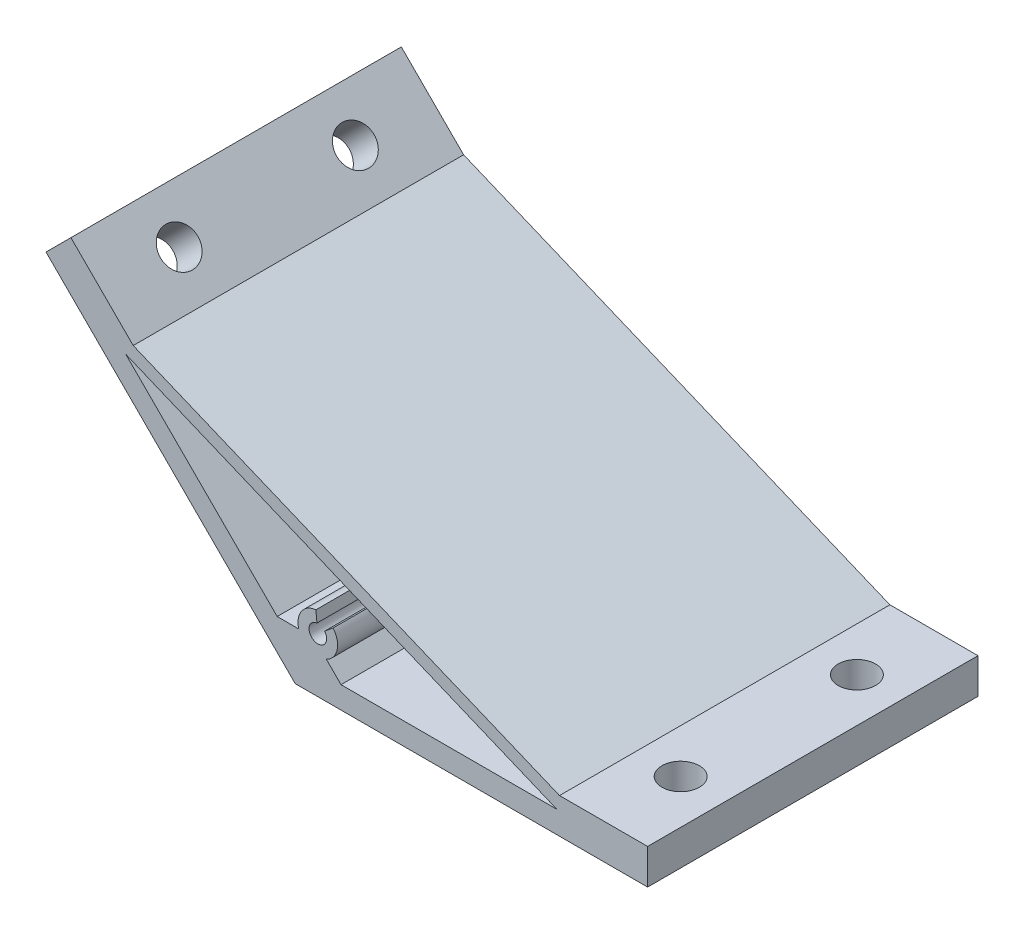
ISO-10303-21;
HEADER;
FILE_DESCRIPTION(('STEP AP214'),'2;1');
FILE_NAME('part.step','',(''),(''),'','','');
FILE_SCHEMA(('AUTOMOTIVE_DESIGN { 1 0 10303 214 1 1 1 1 }'));
ENDSEC;
DATA;
#1=APPLICATION_CONTEXT('core data for automotive mechanical design processes');
#2=APPLICATION_PROTOCOL_DEFINITION('international standard','automotive_design',2000,#1);
#3=PRODUCT_CONTEXT('',#1,'mechanical');
#4=PRODUCT('Part','Part','',(#3));
#5=PRODUCT_RELATED_PRODUCT_CATEGORY('part','',(#4));
#6=PRODUCT_DEFINITION_FORMATION('','',#4);
#7=PRODUCT_DEFINITION_CONTEXT('part definition',#1,'design');
#8=PRODUCT_DEFINITION('design','',#6,#7);
#9=PRODUCT_DEFINITION_SHAPE('','',#8);
#10=(LENGTH_UNIT() NAMED_UNIT(*) SI_UNIT(.MILLI.,.METRE.));
#11=(NAMED_UNIT(*) PLANE_ANGLE_UNIT() SI_UNIT($,.RADIAN.));
#12=(NAMED_UNIT(*) SI_UNIT($,.STERADIAN.) SOLID_ANGLE_UNIT());
#13=UNCERTAINTY_MEASURE_WITH_UNIT(LENGTH_MEASURE(1.E-05),#10,'distance_accuracy_value','');
#14=(GEOMETRIC_REPRESENTATION_CONTEXT(3) GLOBAL_UNCERTAINTY_ASSIGNED_CONTEXT((#13)) GLOBAL_UNIT_ASSIGNED_CONTEXT((#10,
#11,#12)) REPRESENTATION_CONTEXT('',''));
#15=CARTESIAN_POINT('',(0.,0.,0.));
#16=DIRECTION('',(0.,0.,1.));
#17=DIRECTION('',(1.,0.,0.));
#18=AXIS2_PLACEMENT_3D('',#15,#16,#17);
#19=CARTESIAN_POINT('',(580.06230191566,1400.39427630612,37.5));
#20=DIRECTION('',(0.382683432365095,0.923879532511285,0.));
#21=DIRECTION('',(-0.923879532511285,0.382683432365095,0.));
#22=AXIS2_PLACEMENT_3D('',#19,#20,#21);
#23=PLANE('',#22);
#24=DIRECTION('',(0.923879532511285,-0.382683432365095,0.));
#25=VECTOR('',#24,1.);
#26=CARTESIAN_POINT('',(580.06230191566,1400.39427630612,-37.5));
#27=LINE('',#26,#25);
#28=CARTESIAN_POINT('',(6955.91811216156,-1240.57167203307,-37.5));
#29=VERTEX_POINT('',#28);
#30=CARTESIAN_POINT('',(7052.68766478326,-1280.65493315376,-37.5));
#31=VERTEX_POINT('',#30);
#32=EDGE_CURVE('E298',#29,#31,#27,.T.);
#33=ORIENTED_EDGE('',*,*,#32,.F.);
#34=DIRECTION('',(0.,0.,-1.));
#35=VECTOR('',#34,1.);
#36=CARTESIAN_POINT('',(6955.91811216156,-1240.57167203307,37.5));
#37=LINE('',#36,#35);
#38=CARTESIAN_POINT('',(6955.91811216156,-1240.57167203307,37.5));
#39=VERTEX_POINT('',#38);
#40=EDGE_CURVE('E11',#39,#29,#37,.T.);
#41=ORIENTED_EDGE('',*,*,#40,.F.);
#42=DIRECTION('',(0.923879532511285,-0.382683432365095,0.));
#43=VECTOR('',#42,1.);
#44=CARTESIAN_POINT('',(580.06230191566,1400.39427630612,37.5));
#45=LINE('',#44,#43);
#46=CARTESIAN_POINT('',(7052.68766478326,-1280.65493315376,37.5));
#47=VERTEX_POINT('',#46);
#48=EDGE_CURVE('E263',#39,#47,#45,.T.);
#49=ORIENTED_EDGE('',*,*,#48,.T.);
#50=DIRECTION('',(0.,0.,-1.));
#51=VECTOR('',#50,1.);
#52=CARTESIAN_POINT('',(7052.68766478326,-1280.65493315376,37.5));
#53=LINE('',#52,#51);
#54=EDGE_CURVE('E56',#47,#31,#53,.T.);
#55=ORIENTED_EDGE('',*,*,#54,.T.);
#56=EDGE_LOOP('',(#33,#41,#49,#55));
#57=FACE_BOUND('',#56,.T.);
#58=ADVANCED_FACE('F37',(#57),#23,.T.);
#59=CARTESIAN_POINT('',(2857.67322006435,2857.67322006426,37.5));
#60=DIRECTION('',(-0.707106781186559,-0.707106781186536,0.));
#61=DIRECTION('',(0.707106781186536,-0.707106781186559,0.));
#62=AXIS2_PLACEMENT_3D('',#59,#60,#61);
#63=PLANE('',#62);
#64=CARTESIAN_POINT('',(6948.84704434969,-1233.50060422121,-20.));
#65=DIRECTION('',(-0.707106781186559,-0.707106781186536,0.));
#66=DIRECTION('',(0.707106781186536,-0.707106781186559,0.));
#67=AXIS2_PLACEMENT_3D('',#64,#65,#66);
#68=CIRCLE('',#67,4.24999999999998);
#69=CARTESIAN_POINT('',(6951.85224816974,-1236.50580804125,-20.));
#70=VERTEX_POINT('',#69);
#71=EDGE_CURVE('E217',#70,#70,#68,.T.);
#72=ORIENTED_EDGE('',*,*,#71,.T.);
#73=EDGE_LOOP('',(#72));
#74=FACE_BOUND('',#73,.T.);
#75=CARTESIAN_POINT('',(6948.84704434969,-1233.50060422121,20.));
#76=DIRECTION('',(-0.707106781186559,-0.707106781186536,0.));
#77=DIRECTION('',(0.707106781186536,-0.707106781186559,0.));
#78=AXIS2_PLACEMENT_3D('',#75,#76,#77);
#79=CIRCLE('',#78,4.24999999999998);
#80=CARTESIAN_POINT('',(6951.85224816974,-1236.50580804125,20.));
#81=VERTEX_POINT('',#80);
#82=EDGE_CURVE('E224',#81,#81,#79,.T.);
#83=ORIENTED_EDGE('',*,*,#82,.T.);
#84=EDGE_LOOP('',(#83));
#85=FACE_BOUND('',#84,.T.);
#86=DIRECTION('',(-0.707106781186536,0.707106781186559,0.));
#87=VECTOR('',#86,1.);
#88=CARTESIAN_POINT('',(2857.67322006435,2857.67322006426,-37.5));
#89=LINE('',#88,#87);
#90=CARTESIAN_POINT('',(6941.77597653783,-1226.42953640934,-37.5));
#91=VERTEX_POINT('',#90);
#92=EDGE_CURVE('E300',#29,#91,#89,.T.);
#93=ORIENTED_EDGE('',*,*,#92,.T.);
#94=DIRECTION('',(0.,0.,-1.));
#95=VECTOR('',#94,1.);
#96=CARTESIAN_POINT('',(6941.77597653783,-1226.42953640934,37.5));
#97=LINE('',#96,#95);
#98=CARTESIAN_POINT('',(6941.77597653783,-1226.42953640934,37.5));
#99=VERTEX_POINT('',#98);
#100=EDGE_CURVE('E47',#99,#91,#97,.T.);
#101=ORIENTED_EDGE('',*,*,#100,.F.);
#102=DIRECTION('',(-0.707106781186536,0.707106781186559,0.));
#103=VECTOR('',#102,1.);
#104=CARTESIAN_POINT('',(2857.67322006435,2857.67322006426,37.5));
#105=LINE('',#104,#103);
#106=EDGE_CURVE('E265',#39,#99,#105,.T.);
#107=ORIENTED_EDGE('',*,*,#106,.F.);
#108=ORIENTED_EDGE('',*,*,#40,.T.);
#109=EDGE_LOOP('',(#93,#101,#107,#108));
#110=FACE_BOUND('',#109,.T.);
#111=ADVANCED_FACE('F335',(#74,#85,#110),#63,.F.);
#112=CARTESIAN_POINT('',(4084.10275647372,-4084.10275647356,37.5));
#113=DIRECTION('',(-0.707106781186561,0.707106781186534,0.));
#114=DIRECTION('',(-0.707106781186534,-0.707106781186561,0.));
#115=AXIS2_PLACEMENT_3D('',#112,#113,#114);
#116=PLANE('',#115);
#117=DIRECTION('',(0.707106781186534,0.707106781186561,0.));
#118=VECTOR('',#117,1.);
#119=CARTESIAN_POINT('',(4084.10275647372,-4084.10275647356,-37.5));
#120=LINE('',#119,#118);
#121=CARTESIAN_POINT('',(6936.11912228834,-1232.08639065884,-37.5));
#122=VERTEX_POINT('',#121);
#123=EDGE_CURVE('E303',#122,#91,#120,.T.);
#124=ORIENTED_EDGE('',*,*,#123,.F.);
#125=DIRECTION('',(0.,0.,-1.));
#126=VECTOR('',#125,1.);
#127=CARTESIAN_POINT('',(6936.11912228834,-1232.08639065884,37.5));
#128=LINE('',#127,#126);
#129=CARTESIAN_POINT('',(6936.11912228834,-1232.08639065884,37.5));
#130=VERTEX_POINT('',#129);
#131=EDGE_CURVE('E189',#130,#122,#128,.T.);
#132=ORIENTED_EDGE('',*,*,#131,.F.);
#133=DIRECTION('',(0.707106781186534,0.707106781186561,0.));
#134=VECTOR('',#133,1.);
#135=CARTESIAN_POINT('',(4084.10275647372,-4084.10275647356,37.5));
#136=LINE('',#135,#134);
#137=EDGE_CURVE('E267',#130,#99,#136,.T.);
#138=ORIENTED_EDGE('',*,*,#137,.T.);
#139=ORIENTED_EDGE('',*,*,#100,.T.);
#140=EDGE_LOOP('',(#124,#132,#138,#139));
#141=FACE_BOUND('',#140,.T.);
#142=ADVANCED_FACE('F340',(#141),#116,.T.);
#143=CARTESIAN_POINT('',(2852.0163658146,2852.01636581472,37.5));
#144=DIRECTION('',(-0.707106781186532,-0.707106781186563,0.));
#145=DIRECTION('',(0.707106781186563,-0.707106781186532,0.));
#146=AXIS2_PLACEMENT_3D('',#143,#144,#145);
#147=PLANE('',#146);
#148=CARTESIAN_POINT('',(6943.1901901002,-1239.1574584707,-20.));
#149=DIRECTION('',(-0.707106781186532,-0.707106781186563,0.));
#150=DIRECTION('',(0.707106781186563,-0.707106781186532,0.));
#151=AXIS2_PLACEMENT_3D('',#148,#149,#150);
#152=CIRCLE('',#151,4.24999999999999);
#153=CARTESIAN_POINT('',(6946.19539392024,-1242.16266229074,-20.));
#154=VERTEX_POINT('',#153);
#155=EDGE_CURVE('E220',#154,#154,#152,.T.);
#156=ORIENTED_EDGE('',*,*,#155,.F.);
#157=EDGE_LOOP('',(#156));
#158=FACE_BOUND('',#157,.T.);
#159=CARTESIAN_POINT('',(6943.1901901002,-1239.1574584707,20.));
#160=DIRECTION('',(-0.707106781186532,-0.707106781186563,0.));
#161=DIRECTION('',(0.707106781186563,-0.707106781186532,0.));
#162=AXIS2_PLACEMENT_3D('',#159,#160,#161);
#163=CIRCLE('',#162,4.24999999999999);
#164=CARTESIAN_POINT('',(6946.19539392024,-1242.16266229074,20.));
#165=VERTEX_POINT('',#164);
#166=EDGE_CURVE('E219',#165,#165,#163,.T.);
#167=ORIENTED_EDGE('',*,*,#166,.F.);
#168=EDGE_LOOP('',(#167));
#169=FACE_BOUND('',#168,.T.);
#170=DIRECTION('',(-0.707106781186563,0.707106781186532,0.));
#171=VECTOR('',#170,1.);
#172=CARTESIAN_POINT('',(2852.0163658146,2852.01636581472,-37.5));
#173=LINE('',#172,#171);
#174=CARTESIAN_POINT('',(6992.68766478326,-1288.65493315376,-37.5));
#175=VERTEX_POINT('',#174);
#176=EDGE_CURVE('E306',#175,#122,#173,.T.);
#177=ORIENTED_EDGE('',*,*,#176,.F.);
#178=DIRECTION('',(0.,0.,-1.));
#179=VECTOR('',#178,1.);
#180=CARTESIAN_POINT('',(6992.68766478326,-1288.65493315376,37.5));
#181=LINE('',#180,#179);
#182=CARTESIAN_POINT('',(6992.68766478326,-1288.65493315376,37.5));
#183=VERTEX_POINT('',#182);
#184=EDGE_CURVE('E187',#183,#175,#181,.T.);
#185=ORIENTED_EDGE('',*,*,#184,.F.);
#186=DIRECTION('',(-0.707106781186563,0.707106781186532,0.));
#187=VECTOR('',#186,1.);
#188=CARTESIAN_POINT('',(2852.0163658146,2852.01636581472,37.5));
#189=LINE('',#188,#187);
#190=EDGE_CURVE('E181',#183,#130,#189,.T.);
#191=ORIENTED_EDGE('',*,*,#190,.T.);
#192=ORIENTED_EDGE('',*,*,#131,.T.);
#193=EDGE_LOOP('',(#177,#185,#191,#192));
#194=FACE_BOUND('',#193,.T.);
#195=ADVANCED_FACE('F433',(#158,#169,#194),#147,.T.);
#196=CARTESIAN_POINT('',(0.,-1288.65493315376,37.5));
#197=DIRECTION('',(0.,1.,0.));
#198=DIRECTION('',(0.,0.,1.));
#199=AXIS2_PLACEMENT_3D('',#196,#197,#198);
#200=PLANE('',#199);
#201=CARTESIAN_POINT('',(7062.68766478326,-1288.65493315376,-20.));
#202=DIRECTION('',(0.,-1.,0.));
#203=DIRECTION('',(0.,0.,-1.));
#204=AXIS2_PLACEMENT_3D('',#201,#202,#203);
#205=CIRCLE('',#204,4.24999999999986);
#206=CARTESIAN_POINT('',(7062.68766478326,-1288.65493315376,-24.2499999999999));
#207=VERTEX_POINT('',#206);
#208=EDGE_CURVE('E425',#207,#207,#205,.T.);
#209=ORIENTED_EDGE('',*,*,#208,.F.);
#210=EDGE_LOOP('',(#209));
#211=FACE_BOUND('',#210,.T.);
#212=CARTESIAN_POINT('',(7062.68766478326,-1288.65493315376,20.));
#213=DIRECTION('',(0.,-1.,0.));
#214=DIRECTION('',(0.,0.,-1.));
#215=AXIS2_PLACEMENT_3D('',#212,#213,#214);
#216=CIRCLE('',#215,4.24999999999986);
#217=CARTESIAN_POINT('',(7062.68766478326,-1288.65493315376,15.7500000000001));
#218=VERTEX_POINT('',#217);
#219=EDGE_CURVE('E232',#218,#218,#216,.T.);
#220=ORIENTED_EDGE('',*,*,#219,.F.);
#221=EDGE_LOOP('',(#220));
#222=FACE_BOUND('',#221,.T.);
#223=DIRECTION('',(1.,0.,0.));
#224=VECTOR('',#223,1.);
#225=CARTESIAN_POINT('',(0.,-1288.65493315376,-37.5));
#226=LINE('',#225,#224);
#227=CARTESIAN_POINT('',(7072.68766478326,-1288.65493315376,-37.5));
#228=VERTEX_POINT('',#227);
#229=EDGE_CURVE('E186',#175,#228,#226,.T.);
#230=ORIENTED_EDGE('',*,*,#229,.T.);
#231=DIRECTION('',(0.,0.,-1.));
#232=VECTOR('',#231,1.);
#233=CARTESIAN_POINT('',(7072.68766478326,-1288.65493315376,37.5));
#234=LINE('',#233,#232);
#235=CARTESIAN_POINT('',(7072.68766478326,-1288.65493315376,37.5));
#236=VERTEX_POINT('',#235);
#237=EDGE_CURVE('E168',#236,#228,#234,.T.);
#238=ORIENTED_EDGE('',*,*,#237,.F.);
#239=DIRECTION('',(1.,0.,0.));
#240=VECTOR('',#239,1.);
#241=CARTESIAN_POINT('',(0.,-1288.65493315376,37.5));
#242=LINE('',#241,#240);
#243=EDGE_CURVE('E173',#183,#236,#242,.T.);
#244=ORIENTED_EDGE('',*,*,#243,.F.);
#245=ORIENTED_EDGE('',*,*,#184,.T.);
#246=EDGE_LOOP('',(#230,#238,#244,#245));
#247=FACE_BOUND('',#246,.T.);
#248=ADVANCED_FACE('F184',(#211,#222,#247),#200,.F.);
#249=CARTESIAN_POINT('',(7072.68766478326,0.,37.5));
#250=DIRECTION('',(-1.,0.,0.));
#251=DIRECTION('',(0.,0.,1.));
#252=AXIS2_PLACEMENT_3D('',#249,#250,#251);
#253=PLANE('',#252);
#254=DIRECTION('',(0.,1.,0.));
#255=VECTOR('',#254,1.);
#256=CARTESIAN_POINT('',(7072.68766478326,0.,-37.5));
#257=LINE('',#256,#255);
#258=CARTESIAN_POINT('',(7072.68766478326,-1280.65493315376,-37.5));
#259=VERTEX_POINT('',#258);
#260=EDGE_CURVE('E310',#228,#259,#257,.T.);
#261=ORIENTED_EDGE('',*,*,#260,.T.);
#262=DIRECTION('',(0.,0.,-1.));
#263=VECTOR('',#262,1.);
#264=CARTESIAN_POINT('',(7072.68766478326,-1280.65493315376,37.5));
#265=LINE('',#264,#263);
#266=CARTESIAN_POINT('',(7072.68766478326,-1280.65493315376,37.5));
#267=VERTEX_POINT('',#266);
#268=EDGE_CURVE('E109',#267,#259,#265,.T.);
#269=ORIENTED_EDGE('',*,*,#268,.F.);
#270=DIRECTION('',(0.,1.,0.));
#271=VECTOR('',#270,1.);
#272=CARTESIAN_POINT('',(7072.68766478326,0.,37.5));
#273=LINE('',#272,#271);
#274=EDGE_CURVE('E164',#236,#267,#273,.T.);
#275=ORIENTED_EDGE('',*,*,#274,.F.);
#276=ORIENTED_EDGE('',*,*,#237,.T.);
#277=EDGE_LOOP('',(#261,#269,#275,#276));
#278=FACE_BOUND('',#277,.T.);
#279=ADVANCED_FACE('F166',(#278),#253,.F.);
#280=CARTESIAN_POINT('',(6997.82073881189,-1276.26412007604,37.5));
#281=DIRECTION('',(0.,0.,-1.));
#282=DIRECTION('',(-1.,0.,0.));
#283=AXIS2_PLACEMENT_3D('',#280,#281,#282);
#284=CYLINDRICAL_SURFACE('',#283,1.99999999999993);
#285=CARTESIAN_POINT('',(6997.82073881189,-1276.26412007604,-37.5));
#286=DIRECTION('',(0.,0.,1.));
#287=DIRECTION('',(1.,0.,0.));
#288=AXIS2_PLACEMENT_3D('',#285,#286,#287);
#289=CIRCLE('',#288,1.99999999999993);
#290=CARTESIAN_POINT('',(6997.62653003943,-1274.27357167103,-37.5));
#291=VERTEX_POINT('',#290);
#292=CARTESIAN_POINT('',(6999.36559542733,-1274.99391614055,-37.5));
#293=VERTEX_POINT('',#292);
#294=EDGE_CURVE('E238',#291,#293,#289,.T.);
#295=ORIENTED_EDGE('',*,*,#294,.F.);
#296=DIRECTION('',(0.,0.,-1.));
#297=VECTOR('',#296,1.);
#298=CARTESIAN_POINT('',(6997.62653003943,-1274.27357167103,37.5));
#299=LINE('',#298,#297);
#300=CARTESIAN_POINT('',(6997.62653003943,-1274.27357167103,37.5));
#301=VERTEX_POINT('',#300);
#302=EDGE_CURVE('E121',#301,#291,#299,.T.);
#303=ORIENTED_EDGE('',*,*,#302,.F.);
#304=CARTESIAN_POINT('',(6997.82073881189,-1276.26412007604,37.5));
#305=DIRECTION('',(0.,0.,1.));
#306=DIRECTION('',(1.,0.,0.));
#307=AXIS2_PLACEMENT_3D('',#304,#305,#306);
#308=CIRCLE('',#307,1.99999999999993);
#309=CARTESIAN_POINT('',(6999.36559542733,-1274.99391614055,37.5));
#310=VERTEX_POINT('',#309);
#311=EDGE_CURVE('E239',#301,#310,#308,.T.);
#312=ORIENTED_EDGE('',*,*,#311,.T.);
#313=DIRECTION('',(0.,0.,-1.));
#314=VECTOR('',#313,1.);
#315=CARTESIAN_POINT('',(6999.36559542733,-1274.99391614055,37.5));
#316=LINE('',#315,#314);
#317=EDGE_CURVE('E196',#310,#293,#316,.T.);
#318=ORIENTED_EDGE('',*,*,#317,.T.);
#319=EDGE_LOOP('',(#295,#303,#312,#318));
#320=FACE_BOUND('',#319,.T.);
#321=ADVANCED_FACE('F39',(#320),#284,.F.);
#322=CARTESIAN_POINT('',(6808.49128288336,664.273589646761,37.5));
#323=DIRECTION('',(-0.9952742025064,-0.0971043862307417,0.));
#324=DIRECTION('',(0.0971043862307417,-0.9952742025064,0.));
#325=AXIS2_PLACEMENT_3D('',#322,#323,#324);
#326=PLANE('',#325);
#327=DIRECTION('',(-0.0971043862307417,0.9952742025064,0.));
#328=VECTOR('',#327,1.);
#329=CARTESIAN_POINT('',(6808.49128288336,664.273589646761,-37.5));
#330=LINE('',#329,#328);
#331=CARTESIAN_POINT('',(6997.38376907385,-1271.78538616476,-37.5));
#332=VERTEX_POINT('',#331);
#333=EDGE_CURVE('E274',#291,#332,#330,.T.);
#334=ORIENTED_EDGE('',*,*,#333,.T.);
#335=DIRECTION('',(0.,0.,-1.));
#336=VECTOR('',#335,1.);
#337=CARTESIAN_POINT('',(6997.38376907385,-1271.78538616476,37.5));
#338=LINE('',#337,#336);
#339=CARTESIAN_POINT('',(6997.38376907385,-1271.78538616476,37.5));
#340=VERTEX_POINT('',#339);
#341=EDGE_CURVE('E214',#340,#332,#338,.T.);
#342=ORIENTED_EDGE('',*,*,#341,.F.);
#343=DIRECTION('',(-0.0971043862307417,0.9952742025064,0.));
#344=VECTOR('',#343,1.);
#345=CARTESIAN_POINT('',(6808.49128288336,664.273589646761,37.5));
#346=LINE('',#345,#344);
#347=EDGE_CURVE('E241',#301,#340,#346,.T.);
#348=ORIENTED_EDGE('',*,*,#347,.F.);
#349=ORIENTED_EDGE('',*,*,#302,.T.);
#350=EDGE_LOOP('',(#334,#342,#348,#349));
#351=FACE_BOUND('',#350,.T.);
#352=ADVANCED_FACE('F369',(#351),#326,.F.);
#353=CARTESIAN_POINT('',(6997.82073881189,-1276.26412007604,37.5));
#354=DIRECTION('',(0.,0.,-1.));
#355=DIRECTION('',(-1.,0.,0.));
#356=AXIS2_PLACEMENT_3D('',#353,#354,#355);
#357=CYLINDRICAL_SURFACE('',#356,4.49999999999951);
#358=CARTESIAN_POINT('',(6997.82073881189,-1276.26412007604,-37.5));
#359=DIRECTION('',(0.,0.,1.));
#360=DIRECTION('',(1.,0.,0.));
#361=AXIS2_PLACEMENT_3D('',#358,#359,#360);
#362=CIRCLE('',#361,4.49999999999951);
#363=CARTESIAN_POINT('',(6993.49338103034,-1277.49861374974,-37.5));
#364=VERTEX_POINT('',#363);
#365=EDGE_CURVE('E276',#332,#364,#362,.T.);
#366=ORIENTED_EDGE('',*,*,#365,.T.);
#367=DIRECTION('',(0.,0.,-1.));
#368=VECTOR('',#367,1.);
#369=CARTESIAN_POINT('',(6993.49338103034,-1277.49861374974,37.5));
#370=LINE('',#369,#368);
#371=CARTESIAN_POINT('',(6993.49338103034,-1277.49861374974,37.5));
#372=VERTEX_POINT('',#371);
#373=EDGE_CURVE('E212',#372,#364,#370,.T.);
#374=ORIENTED_EDGE('',*,*,#373,.F.);
#375=CARTESIAN_POINT('',(6997.82073881189,-1276.26412007604,37.5));
#376=DIRECTION('',(0.,0.,1.));
#377=DIRECTION('',(1.,0.,0.));
#378=AXIS2_PLACEMENT_3D('',#375,#376,#377);
#379=CIRCLE('',#378,4.49999999999951);
#380=EDGE_CURVE('E244',#340,#372,#379,.T.);
#381=ORIENTED_EDGE('',*,*,#380,.F.);
#382=ORIENTED_EDGE('',*,*,#341,.T.);
#383=EDGE_LOOP('',(#366,#374,#381,#382));
#384=FACE_BOUND('',#383,.T.);
#385=ADVANCED_FACE('F366',(#384),#357,.T.);
#386=CARTESIAN_POINT('',(1.15994087185971E-09,-1277.49861375609,37.5));
#387=DIRECTION('',(-9.079781843749E-13,1.,0.));
#388=DIRECTION('',(-1.,-9.079781843749E-13,0.));
#389=AXIS2_PLACEMENT_3D('',#386,#387,#388);
#390=PLANE('',#389);
#391=DIRECTION('',(1.,9.079781843749E-13,0.));
#392=VECTOR('',#391,1.);
#393=CARTESIAN_POINT('',(1.15994087185971E-09,-1277.49861375609,-37.5));
#394=LINE('',#393,#392);
#395=CARTESIAN_POINT('',(6988.60241319111,-1277.49861374974,-37.5));
#396=VERTEX_POINT('',#395);
#397=EDGE_CURVE('E279',#396,#364,#394,.T.);
#398=ORIENTED_EDGE('',*,*,#397,.F.);
#399=DIRECTION('',(0.,0.,-1.));
#400=VECTOR('',#399,1.);
#401=CARTESIAN_POINT('',(6988.60241319111,-1277.49861374974,37.5));
#402=LINE('',#401,#400);
#403=CARTESIAN_POINT('',(6988.60241319111,-1277.49861374974,37.5));
#404=VERTEX_POINT('',#403);
#405=EDGE_CURVE('E210',#404,#396,#402,.T.);
#406=ORIENTED_EDGE('',*,*,#405,.F.);
#407=DIRECTION('',(1.,9.079781843749E-13,0.));
#408=VECTOR('',#407,1.);
#409=CARTESIAN_POINT('',(1.15994087185971E-09,-1277.49861375609,37.5));
#410=LINE('',#409,#408);
#411=EDGE_CURVE('E246',#404,#372,#410,.T.);
#412=ORIENTED_EDGE('',*,*,#411,.T.);
#413=ORIENTED_EDGE('',*,*,#373,.T.);
#414=EDGE_LOOP('',(#398,#406,#412,#413));
#415=FACE_BOUND('',#414,.T.);
#416=ADVANCED_FACE('F362',(#415),#390,.T.);
#417=CARTESIAN_POINT('',(2855.55189972073,2855.55189972069,37.5));
#418=DIRECTION('',(-0.707106781186552,-0.707106781186543,0.));
#419=DIRECTION('',(0.707106781186543,-0.707106781186552,0.));
#420=AXIS2_PLACEMENT_3D('',#417,#418,#419);
#421=PLANE('',#420);
#422=DIRECTION('',(-0.707106781186543,0.707106781186552,0.));
#423=VECTOR('',#422,1.);
#424=CARTESIAN_POINT('',(2855.55189972073,2855.55189972069,-37.5));
#425=LINE('',#424,#423);
#426=CARTESIAN_POINT('',(6954.21874866951,-1243.11494922814,-37.5));
#427=VERTEX_POINT('',#426);
#428=EDGE_CURVE('E282',#396,#427,#425,.T.);
#429=ORIENTED_EDGE('',*,*,#428,.T.);
#430=DIRECTION('',(0.,0.,-1.));
#431=VECTOR('',#430,1.);
#432=CARTESIAN_POINT('',(6954.21874866951,-1243.11494922814,37.5));
#433=LINE('',#432,#431);
#434=CARTESIAN_POINT('',(6954.21874866951,-1243.11494922814,37.5));
#435=VERTEX_POINT('',#434);
#436=EDGE_CURVE('E207',#435,#427,#433,.T.);
#437=ORIENTED_EDGE('',*,*,#436,.F.);
#438=DIRECTION('',(-0.707106781186543,0.707106781186552,0.));
#439=VECTOR('',#438,1.);
#440=CARTESIAN_POINT('',(2855.55189972073,2855.55189972069,37.5));
#441=LINE('',#440,#439);
#442=EDGE_CURVE('E249',#404,#435,#441,.T.);
#443=ORIENTED_EDGE('',*,*,#442,.F.);
#444=ORIENTED_EDGE('',*,*,#405,.T.);
#445=EDGE_LOOP('',(#429,#437,#443,#444));
#446=FACE_BOUND('',#445,.T.);
#447=ADVANCED_FACE('F358',(#446),#421,.F.);
#448=CARTESIAN_POINT('',(578.914251618586,1397.62263770862,37.5));
#449=DIRECTION('',(0.3826834323651,0.923879532511283,0.));
#450=DIRECTION('',(-0.923879532511283,0.3826834323651,0.));
#451=AXIS2_PLACEMENT_3D('',#448,#449,#450);
#452=PLANE('',#451);
#453=DIRECTION('',(0.923879532511283,-0.3826834323651,0.));
#454=VECTOR('',#453,1.);
#455=CARTESIAN_POINT('',(578.914251618586,1397.62263770862,-37.5));
#456=LINE('',#455,#454);
#457=CARTESIAN_POINT('',(7052.09092768112,-1283.65493315376,-37.5));
#458=VERTEX_POINT('',#457);
#459=EDGE_CURVE('E284',#427,#458,#456,.T.);
#460=ORIENTED_EDGE('',*,*,#459,.T.);
#461=DIRECTION('',(0.,0.,-1.));
#462=VECTOR('',#461,1.);
#463=CARTESIAN_POINT('',(7052.09092768112,-1283.65493315376,37.5));
#464=LINE('',#463,#462);
#465=CARTESIAN_POINT('',(7052.09092768112,-1283.65493315376,37.5));
#466=VERTEX_POINT('',#465);
#467=EDGE_CURVE('E205',#466,#458,#464,.T.);
#468=ORIENTED_EDGE('',*,*,#467,.F.);
#469=DIRECTION('',(0.923879532511283,-0.3826834323651,0.));
#470=VECTOR('',#469,1.);
#471=CARTESIAN_POINT('',(578.914251618586,1397.62263770862,37.5));
#472=LINE('',#471,#470);
#473=EDGE_CURVE('E251',#435,#466,#472,.T.);
#474=ORIENTED_EDGE('',*,*,#473,.F.);
#475=ORIENTED_EDGE('',*,*,#436,.T.);
#476=EDGE_LOOP('',(#460,#468,#474,#475));
#477=FACE_BOUND('',#476,.T.);
#478=ADVANCED_FACE('F354',(#477),#452,.F.);
#479=CARTESIAN_POINT('',(-5.8169112753506E-12,-1283.65493315373,37.5));
#480=DIRECTION('',(0.,1.,0.));
#481=DIRECTION('',(-1.,0.,0.));
#482=AXIS2_PLACEMENT_3D('',#479,#480,#481);
#483=PLANE('',#482);
#484=DIRECTION('',(1.,0.,0.));
#485=VECTOR('',#484,1.);
#486=CARTESIAN_POINT('',(-5.8169112753506E-12,-1283.65493315373,-37.5));
#487=LINE('',#486,#485);
#488=CARTESIAN_POINT('',(7003.09092768112,-1283.65493315376,-37.5));
#489=VERTEX_POINT('',#488);
#490=EDGE_CURVE('E287',#489,#458,#487,.T.);
#491=ORIENTED_EDGE('',*,*,#490,.F.);
#492=DIRECTION('',(0.,0.,-1.));
#493=VECTOR('',#492,1.);
#494=CARTESIAN_POINT('',(7003.09092768112,-1283.65493315376,37.5));
#495=LINE('',#494,#493);
#496=CARTESIAN_POINT('',(7003.09092768112,-1283.65493315376,37.5));
#497=VERTEX_POINT('',#496);
#498=EDGE_CURVE('E203',#497,#489,#495,.T.);
#499=ORIENTED_EDGE('',*,*,#498,.F.);
#500=DIRECTION('',(1.,0.,0.));
#501=VECTOR('',#500,1.);
#502=CARTESIAN_POINT('',(-5.8169112753506E-12,-1283.65493315373,37.5));
#503=LINE('',#502,#501);
#504=EDGE_CURVE('E253',#497,#466,#503,.T.);
#505=ORIENTED_EDGE('',*,*,#504,.T.);
#506=ORIENTED_EDGE('',*,*,#467,.T.);
#507=EDGE_LOOP('',(#491,#499,#505,#506));
#508=FACE_BOUND('',#507,.T.);
#509=ADVANCED_FACE('F350',(#508),#483,.T.);
#510=CARTESIAN_POINT('',(2859.71799726508,2859.71799726394,37.5));
#511=DIRECTION('',(-0.707106781186689,-0.707106781186406,0.));
#512=DIRECTION('',(0.707106781186406,-0.707106781186689,0.));
#513=AXIS2_PLACEMENT_3D('',#510,#511,#512);
#514=PLANE('',#513);
#515=DIRECTION('',(-0.707106781186406,0.707106781186689,0.));
#516=VECTOR('',#515,1.);
#517=CARTESIAN_POINT('',(2859.71799726508,2859.71799726394,-37.5));
#518=LINE('',#517,#516);
#519=CARTESIAN_POINT('',(6999.76054974539,-1280.32455521803,-37.5));
#520=VERTEX_POINT('',#519);
#521=EDGE_CURVE('E290',#489,#520,#518,.T.);
#522=ORIENTED_EDGE('',*,*,#521,.T.);
#523=DIRECTION('',(0.,0.,-1.));
#524=VECTOR('',#523,1.);
#525=CARTESIAN_POINT('',(6999.76054974539,-1280.32455521803,37.5));
#526=LINE('',#525,#524);
#527=CARTESIAN_POINT('',(6999.76054974539,-1280.32455521803,37.5));
#528=VERTEX_POINT('',#527);
#529=EDGE_CURVE('E200',#528,#520,#526,.T.);
#530=ORIENTED_EDGE('',*,*,#529,.F.);
#531=DIRECTION('',(-0.707106781186406,0.707106781186689,0.));
#532=VECTOR('',#531,1.);
#533=CARTESIAN_POINT('',(2859.71799726508,2859.71799726394,37.5));
#534=LINE('',#533,#532);
#535=EDGE_CURVE('E256',#497,#528,#534,.T.);
#536=ORIENTED_EDGE('',*,*,#535,.F.);
#537=ORIENTED_EDGE('',*,*,#498,.T.);
#538=EDGE_LOOP('',(#522,#530,#536,#537));
#539=FACE_BOUND('',#538,.T.);
#540=ADVANCED_FACE('F346',(#539),#514,.F.);
#541=CARTESIAN_POINT('',(6997.82073881189,-1276.26412007604,37.5));
#542=DIRECTION('',(0.,0.,-1.));
#543=DIRECTION('',(-1.,0.,0.));
#544=AXIS2_PLACEMENT_3D('',#541,#542,#543);
#545=CYLINDRICAL_SURFACE('',#544,4.50000000000019);
#546=CARTESIAN_POINT('',(6997.82073881189,-1276.26412007604,-37.5));
#547=DIRECTION('',(0.,0.,1.));
#548=DIRECTION('',(1.,0.,0.));
#549=AXIS2_PLACEMENT_3D('',#546,#547,#548);
#550=CIRCLE('',#549,4.50000000000019);
#551=CARTESIAN_POINT('',(7001.29666619663,-1273.40616122119,-37.5));
#552=VERTEX_POINT('',#551);
#553=EDGE_CURVE('E292',#520,#552,#550,.T.);
#554=ORIENTED_EDGE('',*,*,#553,.T.);
#555=DIRECTION('',(0.,0.,-1.));
#556=VECTOR('',#555,1.);
#557=CARTESIAN_POINT('',(7001.29666619663,-1273.40616122119,37.5));
#558=LINE('',#557,#556);
#559=CARTESIAN_POINT('',(7001.29666619663,-1273.40616122119,37.5));
#560=VERTEX_POINT('',#559);
#561=EDGE_CURVE('E198',#560,#552,#558,.T.);
#562=ORIENTED_EDGE('',*,*,#561,.F.);
#563=CARTESIAN_POINT('',(6997.82073881189,-1276.26412007604,37.5));
#564=DIRECTION('',(0.,0.,1.));
#565=DIRECTION('',(1.,0.,0.));
#566=AXIS2_PLACEMENT_3D('',#563,#564,#565);
#567=CIRCLE('',#566,4.50000000000019);
#568=EDGE_CURVE('E258',#528,#560,#567,.T.);
#569=ORIENTED_EDGE('',*,*,#568,.F.);
#570=ORIENTED_EDGE('',*,*,#529,.T.);
#571=EDGE_LOOP('',(#554,#562,#569,#570));
#572=FACE_BOUND('',#571,.T.);
#573=ADVANCED_FACE('F327',(#572),#545,.T.);
#574=CARTESIAN_POINT('',(3448.70038270471,-4194.40331746767,37.5));
#575=DIRECTION('',(-0.63510196774562,0.772428307719002,0.));
#576=DIRECTION('',(-0.772428307719002,-0.63510196774562,0.));
#577=AXIS2_PLACEMENT_3D('',#574,#575,#576);
#578=PLANE('',#577);
#579=DIRECTION('',(0.772428307719002,0.63510196774562,0.));
#580=VECTOR('',#579,1.);
#581=CARTESIAN_POINT('',(3448.70038270471,-4194.40331746767,-37.5));
#582=LINE('',#581,#580);
#583=EDGE_CURVE('E295',#293,#552,#582,.T.);
#584=ORIENTED_EDGE('',*,*,#583,.F.);
#585=ORIENTED_EDGE('',*,*,#317,.F.);
#586=DIRECTION('',(0.772428307719002,0.63510196774562,0.));
#587=VECTOR('',#586,1.);
#588=CARTESIAN_POINT('',(3448.70038270471,-4194.40331746767,37.5));
#589=LINE('',#588,#587);
#590=EDGE_CURVE('E260',#310,#560,#589,.T.);
#591=ORIENTED_EDGE('',*,*,#590,.T.);
#592=ORIENTED_EDGE('',*,*,#561,.T.);
#593=EDGE_LOOP('',(#584,#585,#591,#592));
#594=FACE_BOUND('',#593,.T.);
#595=ADVANCED_FACE('F318',(#594),#578,.T.);
#596=CARTESIAN_POINT('',(0.,-1280.65493315376,37.5));
#597=DIRECTION('',(0.,1.,0.));
#598=DIRECTION('',(0.,0.,1.));
#599=AXIS2_PLACEMENT_3D('',#596,#597,#598);
#600=PLANE('',#599);
#601=CARTESIAN_POINT('',(7062.68766478326,-1280.65493315376,-20.));
#602=DIRECTION('',(0.,1.,0.));
#603=DIRECTION('',(0.,0.,1.));
#604=AXIS2_PLACEMENT_3D('',#601,#602,#603);
#605=CIRCLE('',#604,4.24999999999986);
#606=CARTESIAN_POINT('',(7062.68766478326,-1280.65493315376,-15.7500000000001));
#607=VERTEX_POINT('',#606);
#608=EDGE_CURVE('E41',#607,#607,#605,.T.);
#609=ORIENTED_EDGE('',*,*,#608,.F.);
#610=EDGE_LOOP('',(#609));
#611=FACE_BOUND('',#610,.T.);
#612=CARTESIAN_POINT('',(7062.68766478326,-1280.65493315376,20.));
#613=DIRECTION('',(0.,1.,0.));
#614=DIRECTION('',(0.,0.,1.));
#615=AXIS2_PLACEMENT_3D('',#612,#613,#614);
#616=CIRCLE('',#615,4.24999999999986);
#617=CARTESIAN_POINT('',(7062.68766478326,-1280.65493315376,24.2499999999999));
#618=VERTEX_POINT('',#617);
#619=EDGE_CURVE('E227',#618,#618,#616,.T.);
#620=ORIENTED_EDGE('',*,*,#619,.F.);
#621=EDGE_LOOP('',(#620));
#622=FACE_BOUND('',#621,.T.);
#623=DIRECTION('',(1.,0.,0.));
#624=VECTOR('',#623,1.);
#625=CARTESIAN_POINT('',(0.,-1280.65493315376,-37.5));
#626=LINE('',#625,#624);
#627=EDGE_CURVE('E242',#31,#259,#626,.T.);
#628=ORIENTED_EDGE('',*,*,#627,.F.);
#629=ORIENTED_EDGE('',*,*,#54,.F.);
#630=DIRECTION('',(1.,0.,0.));
#631=VECTOR('',#630,1.);
#632=CARTESIAN_POINT('',(0.,-1280.65493315376,37.5));
#633=LINE('',#632,#631);
#634=EDGE_CURVE('E172',#47,#267,#633,.T.);
#635=ORIENTED_EDGE('',*,*,#634,.T.);
#636=ORIENTED_EDGE('',*,*,#268,.T.);
#637=EDGE_LOOP('',(#628,#629,#635,#636));
#638=FACE_BOUND('',#637,.T.);
#639=ADVANCED_FACE('F316',(#611,#622,#638),#600,.T.);
#640=CARTESIAN_POINT('',(0.,0.,37.5));
#641=DIRECTION('',(0.,0.,1.));
#642=DIRECTION('',(1.,0.,0.));
#643=AXIS2_PLACEMENT_3D('',#640,#641,#642);
#644=PLANE('',#643);
#645=ORIENTED_EDGE('',*,*,#311,.F.);
#646=ORIENTED_EDGE('',*,*,#347,.T.);
#647=ORIENTED_EDGE('',*,*,#380,.T.);
#648=ORIENTED_EDGE('',*,*,#411,.F.);
#649=ORIENTED_EDGE('',*,*,#442,.T.);
#650=ORIENTED_EDGE('',*,*,#473,.T.);
#651=ORIENTED_EDGE('',*,*,#504,.F.);
#652=ORIENTED_EDGE('',*,*,#535,.T.);
#653=ORIENTED_EDGE('',*,*,#568,.T.);
#654=ORIENTED_EDGE('',*,*,#590,.F.);
#655=EDGE_LOOP('',(#645,#646,#647,#648,#649,#650,#651,#652,#653,#654));
#656=FACE_BOUND('',#655,.T.);
#657=ORIENTED_EDGE('',*,*,#48,.F.);
#658=ORIENTED_EDGE('',*,*,#106,.T.);
#659=ORIENTED_EDGE('',*,*,#137,.F.);
#660=ORIENTED_EDGE('',*,*,#190,.F.);
#661=ORIENTED_EDGE('',*,*,#243,.T.);
#662=ORIENTED_EDGE('',*,*,#274,.T.);
#663=ORIENTED_EDGE('',*,*,#634,.F.);
#664=EDGE_LOOP('',(#657,#658,#659,#660,#661,#662,#663));
#665=FACE_BOUND('',#664,.T.);
#666=ADVANCED_FACE('F178',(#656,#665),#644,.T.);
#667=CARTESIAN_POINT('',(0.,0.,-37.5));
#668=DIRECTION('',(0.,0.,1.));
#669=DIRECTION('',(1.,0.,0.));
#670=AXIS2_PLACEMENT_3D('',#667,#668,#669);
#671=PLANE('',#670);
#672=ORIENTED_EDGE('',*,*,#294,.T.);
#673=ORIENTED_EDGE('',*,*,#583,.T.);
#674=ORIENTED_EDGE('',*,*,#553,.F.);
#675=ORIENTED_EDGE('',*,*,#521,.F.);
#676=ORIENTED_EDGE('',*,*,#490,.T.);
#677=ORIENTED_EDGE('',*,*,#459,.F.);
#678=ORIENTED_EDGE('',*,*,#428,.F.);
#679=ORIENTED_EDGE('',*,*,#397,.T.);
#680=ORIENTED_EDGE('',*,*,#365,.F.);
#681=ORIENTED_EDGE('',*,*,#333,.F.);
#682=EDGE_LOOP('',(#672,#673,#674,#675,#676,#677,#678,#679,#680,#681));
#683=FACE_BOUND('',#682,.T.);
#684=ORIENTED_EDGE('',*,*,#32,.T.);
#685=ORIENTED_EDGE('',*,*,#627,.T.);
#686=ORIENTED_EDGE('',*,*,#260,.F.);
#687=ORIENTED_EDGE('',*,*,#229,.F.);
#688=ORIENTED_EDGE('',*,*,#176,.T.);
#689=ORIENTED_EDGE('',*,*,#123,.T.);
#690=ORIENTED_EDGE('',*,*,#92,.F.);
#691=EDGE_LOOP('',(#684,#685,#686,#687,#688,#689,#690));
#692=FACE_BOUND('',#691,.T.);
#693=ADVANCED_FACE('F314',(#683,#692),#671,.F.);
#694=CARTESIAN_POINT('',(6943.1901901002,-1239.1574584707,20.));
#695=DIRECTION('',(-0.707106781186532,-0.707106781186563,0.));
#696=DIRECTION('',(0.707106781186563,-0.707106781186532,0.));
#697=AXIS2_PLACEMENT_3D('',#694,#695,#696);
#698=CYLINDRICAL_SURFACE('',#697,4.24999999999998);
#699=ORIENTED_EDGE('',*,*,#166,.T.);
#700=EDGE_LOOP('',(#699));
#701=FACE_BOUND('',#700,.T.);
#702=ORIENTED_EDGE('',*,*,#82,.F.);
#703=EDGE_LOOP('',(#702));
#704=FACE_BOUND('',#703,.T.);
#705=ADVANCED_FACE('F402',(#701,#704),#698,.F.);
#706=CARTESIAN_POINT('',(6943.1901901002,-1239.1574584707,-20.));
#707=DIRECTION('',(-0.707106781186532,-0.707106781186563,0.));
#708=DIRECTION('',(0.707106781186563,-0.707106781186532,0.));
#709=AXIS2_PLACEMENT_3D('',#706,#707,#708);
#710=CYLINDRICAL_SURFACE('',#709,4.24999999999998);
#711=ORIENTED_EDGE('',*,*,#155,.T.);
#712=EDGE_LOOP('',(#711));
#713=FACE_BOUND('',#712,.T.);
#714=ORIENTED_EDGE('',*,*,#71,.F.);
#715=EDGE_LOOP('',(#714));
#716=FACE_BOUND('',#715,.T.);
#717=ADVANCED_FACE('F406',(#713,#716),#710,.F.);
#718=CARTESIAN_POINT('',(7062.68766478326,-1288.65493315376,20.));
#719=DIRECTION('',(0.,-1.,0.));
#720=DIRECTION('',(0.,0.,-1.));
#721=AXIS2_PLACEMENT_3D('',#718,#719,#720);
#722=CYLINDRICAL_SURFACE('',#721,4.24999999999986);
#723=ORIENTED_EDGE('',*,*,#619,.T.);
#724=EDGE_LOOP('',(#723));
#725=FACE_BOUND('',#724,.T.);
#726=ORIENTED_EDGE('',*,*,#219,.T.);
#727=EDGE_LOOP('',(#726));
#728=FACE_BOUND('',#727,.T.);
#729=ADVANCED_FACE('F412',(#725,#728),#722,.F.);
#730=CARTESIAN_POINT('',(7062.68766478326,-1288.65493315376,-20.));
#731=DIRECTION('',(0.,-1.,0.));
#732=DIRECTION('',(0.,0.,-1.));
#733=AXIS2_PLACEMENT_3D('',#730,#731,#732);
#734=CYLINDRICAL_SURFACE('',#733,4.24999999999986);
#735=ORIENTED_EDGE('',*,*,#608,.T.);
#736=EDGE_LOOP('',(#735));
#737=FACE_BOUND('',#736,.T.);
#738=ORIENTED_EDGE('',*,*,#208,.T.);
#739=EDGE_LOOP('',(#738));
#740=FACE_BOUND('',#739,.T.);
#741=ADVANCED_FACE('F415',(#737,#740),#734,.F.);
#742=CLOSED_SHELL('',(#58,#111,#142,#195,#248,#279,#321,#352,#385,#416,#447,#478,#509,#540,#573,
#595,#639,#666,#693,#705,#717,#729,#741));
#743=MANIFOLD_SOLID_BREP('B2',#742);
#744=ADVANCED_BREP_SHAPE_REPRESENTATION('',(#18,#743),#14);
#745=SHAPE_DEFINITION_REPRESENTATION(#9,#744);
ENDSEC;
END-ISO-10303-21;
